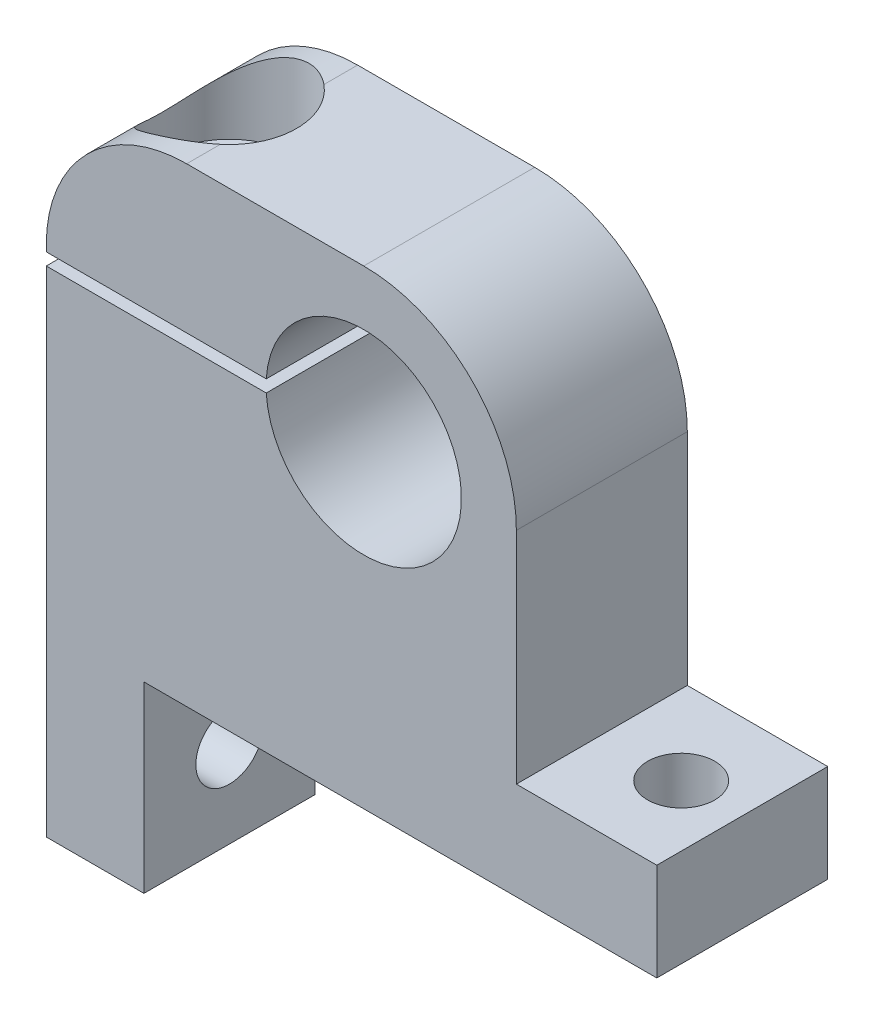
ISO-10303-21;
HEADER;
FILE_DESCRIPTION(('STEP AP214'),'2;1');
FILE_NAME('part.step','',(''),(''),'','','');
FILE_SCHEMA(('AUTOMOTIVE_DESIGN { 1 0 10303 214 1 1 1 1 }'));
ENDSEC;
DATA;
#1=APPLICATION_CONTEXT('core data for automotive mechanical design processes');
#2=APPLICATION_PROTOCOL_DEFINITION('international standard','automotive_design',2000,#1);
#3=PRODUCT_CONTEXT('',#1,'mechanical');
#4=PRODUCT('Part','Part','',(#3));
#5=PRODUCT_RELATED_PRODUCT_CATEGORY('part','',(#4));
#6=PRODUCT_DEFINITION_FORMATION('','',#4);
#7=PRODUCT_DEFINITION_CONTEXT('part definition',#1,'design');
#8=PRODUCT_DEFINITION('design','',#6,#7);
#9=PRODUCT_DEFINITION_SHAPE('','',#8);
#10=(LENGTH_UNIT() NAMED_UNIT(*) SI_UNIT(.MILLI.,.METRE.));
#11=(NAMED_UNIT(*) PLANE_ANGLE_UNIT() SI_UNIT($,.RADIAN.));
#12=(NAMED_UNIT(*) SI_UNIT($,.STERADIAN.) SOLID_ANGLE_UNIT());
#13=UNCERTAINTY_MEASURE_WITH_UNIT(LENGTH_MEASURE(1.E-05),#10,'distance_accuracy_value','');
#14=(GEOMETRIC_REPRESENTATION_CONTEXT(3) GLOBAL_UNCERTAINTY_ASSIGNED_CONTEXT((#13)) GLOBAL_UNIT_ASSIGNED_CONTEXT((#10,
#11,#12)) REPRESENTATION_CONTEXT('',''));
#15=CARTESIAN_POINT('',(0.,0.,0.));
#16=DIRECTION('',(0.,0.,1.));
#17=DIRECTION('',(1.,0.,0.));
#18=AXIS2_PLACEMENT_3D('',#15,#16,#17);
#19=CARTESIAN_POINT('',(-26.,0.499999999999997,14.));
#20=DIRECTION('',(0.,1.,0.));
#21=DIRECTION('',(0.,0.,1.));
#22=AXIS2_PLACEMENT_3D('',#19,#20,#21);
#23=PLANE('',#22);
#24=DIRECTION('',(1.,0.,0.));
#25=VECTOR('',#24,1.);
#26=CARTESIAN_POINT('',(-26.,0.499999999999997,0.));
#27=LINE('',#26,#25);
#28=CARTESIAN_POINT('',(-26.,0.499999999999997,0.));
#29=VERTEX_POINT('',#28);
#30=CARTESIAN_POINT('',(-7.98435971133565,0.499999999999998,0.));
#31=VERTEX_POINT('',#30);
#32=EDGE_CURVE('E191',#29,#31,#27,.T.);
#33=ORIENTED_EDGE('',*,*,#32,.T.);
#34=DIRECTION('',(0.,0.,-1.));
#35=VECTOR('',#34,1.);
#36=CARTESIAN_POINT('',(-7.98435971133565,0.499999999999998,14.));
#37=LINE('',#36,#35);
#38=CARTESIAN_POINT('',(-7.98435971133565,0.499999999999998,14.));
#39=VERTEX_POINT('',#38);
#40=EDGE_CURVE('E242',#39,#31,#37,.T.);
#41=ORIENTED_EDGE('',*,*,#40,.F.);
#42=DIRECTION('',(1.,0.,0.));
#43=VECTOR('',#42,1.);
#44=CARTESIAN_POINT('',(-26.,0.499999999999997,14.));
#45=LINE('',#44,#43);
#46=CARTESIAN_POINT('',(-26.,0.499999999999997,14.));
#47=VERTEX_POINT('',#46);
#48=EDGE_CURVE('E271',#47,#39,#45,.T.);
#49=ORIENTED_EDGE('',*,*,#48,.F.);
#50=DIRECTION('',(0.,0.,-1.));
#51=VECTOR('',#50,1.);
#52=CARTESIAN_POINT('',(-26.,0.499999999999997,14.));
#53=LINE('',#52,#51);
#54=EDGE_CURVE('E245',#47,#29,#53,.T.);
#55=ORIENTED_EDGE('',*,*,#54,.T.);
#56=EDGE_LOOP('',(#33,#41,#49,#55));
#57=FACE_BOUND('',#56,.T.);
#58=CARTESIAN_POINT('',(-18.,0.499999999999997,7.));
#59=DIRECTION('',(0.,1.,0.));
#60=DIRECTION('',(0.,0.,1.));
#61=AXIS2_PLACEMENT_3D('',#58,#59,#60);
#62=CIRCLE('',#61,3.3);
#63=CARTESIAN_POINT('',(-18.,0.499999999999997,10.3));
#64=VERTEX_POINT('',#63);
#65=EDGE_CURVE('E259',#64,#64,#62,.F.);
#66=ORIENTED_EDGE('',*,*,#65,.F.);
#67=EDGE_LOOP('',(#66));
#68=FACE_BOUND('',#67,.T.);
#69=ADVANCED_FACE('F38',(#57,#68),#23,.F.);
#70=CARTESIAN_POINT('',(-14.5,0.999999999999999,14.));
#71=DIRECTION('',(0.,0.,-1.));
#72=DIRECTION('',(-1.,0.,0.));
#73=AXIS2_PLACEMENT_3D('',#70,#71,#72);
#74=CYLINDRICAL_SURFACE('',#73,11.5);
#75=DIRECTION('',(0.,0.,-1.));
#76=VECTOR('',#75,1.);
#77=CARTESIAN_POINT('',(-14.5,12.5,14.));
#78=LINE('',#77,#76);
#79=CARTESIAN_POINT('',(-14.5,12.5,14.));
#80=VERTEX_POINT('',#79);
#81=CARTESIAN_POINT('',(-14.5,12.5,11.2426406871193));
#82=VERTEX_POINT('',#81);
#83=EDGE_CURVE('E216',#80,#82,#78,.T.);
#84=ORIENTED_EDGE('',*,*,#83,.T.);
#85=CARTESIAN_POINT('',(-14.5,12.5,11.2426406871193));
#86=CARTESIAN_POINT('',(-14.6111942466584,12.5000106687531,11.3343966450895));
#87=CARTESIAN_POINT('',(-14.7260298038202,12.4983878808196,11.4217587191783));
#88=CARTESIAN_POINT('',(-14.9621378836701,12.4913147106558,11.5871686776096));
#89=CARTESIAN_POINT('',(-15.083411451809,12.4858637050034,11.6652150424742));
#90=CARTESIAN_POINT('',(-15.3313790533495,12.470581311947,11.811357908409));
#91=CARTESIAN_POINT('',(-15.4580670874255,12.4607546646271,11.8794650707877));
#92=CARTESIAN_POINT('',(-15.7159959321144,12.4362637000279,12.0053886085369));
#93=CARTESIAN_POINT('',(-15.8472363270452,12.4215998234073,12.063205920547));
#94=CARTESIAN_POINT('',(-16.1134385157996,12.387047758436,12.1683067889332));
#95=CARTESIAN_POINT('',(-16.2484056943317,12.3671516140405,12.2155740991615));
#96=CARTESIAN_POINT('',(-16.520816595921,12.3218978003502,12.2992761324464));
#97=CARTESIAN_POINT('',(-16.6582612129436,12.2965381219042,12.3357068587105));
#98=CARTESIAN_POINT('',(-16.9343274967822,12.2402790660783,12.397623048531));
#99=CARTESIAN_POINT('',(-17.0729478971216,12.209385068319,12.4231190601802));
#100=CARTESIAN_POINT('',(-17.3504563774279,12.1420508157764,12.4633103785247));
#101=CARTESIAN_POINT('',(-17.4893445384066,12.105608481257,12.4780016230754));
#102=CARTESIAN_POINT('',(-17.7650961472038,12.0276690323539,12.4967030599054));
#103=CARTESIAN_POINT('',(-17.9019666656709,11.986219103638,12.5008058909148));
#104=CARTESIAN_POINT('',(-18.1740200623172,11.8982596851884,12.4989316530094));
#105=CARTESIAN_POINT('',(-18.3092023185868,11.8517483889019,12.4929509738773));
#106=CARTESIAN_POINT('',(-18.7110098358027,11.7050661875066,12.4604550126368));
#107=CARTESIAN_POINT('',(-18.9739835021156,11.5977221358029,12.419391221956));
#108=CARTESIAN_POINT('',(-19.5066774138159,11.3574130494193,12.297271628149));
#109=CARTESIAN_POINT('',(-19.775011806133,11.2230346480178,12.2130622404469));
#110=CARTESIAN_POINT('',(-20.2897723552809,10.9405600576022,12.0083627948227));
#111=CARTESIAN_POINT('',(-20.5361894936106,10.7924582724079,11.887857890681));
#112=CARTESIAN_POINT('',(-20.9070851160675,10.5512294614554,11.6716102560195));
#113=CARTESIAN_POINT('',(-21.0396726837202,10.4608410088857,11.5863964044509));
#114=CARTESIAN_POINT('',(-21.2962446452161,10.2782440543976,11.4056084668565));
#115=CARTESIAN_POINT('',(-21.4202305420481,10.1860358740793,11.3100361982955));
#116=CARTESIAN_POINT('',(-21.6594687855619,10.0008293561667,11.1088626302598));
#117=CARTESIAN_POINT('',(-21.7747104184476,9.90783019970305,11.0032493739045));
#118=CARTESIAN_POINT('',(-21.9960206054591,9.72241384350424,10.7823616717934));
#119=CARTESIAN_POINT('',(-22.1020901593416,9.6299965813633,10.6670882816964));
#120=CARTESIAN_POINT('',(-22.296666057787,9.45445319118981,10.4365058789902));
#121=CARTESIAN_POINT('',(-22.3858982532455,9.37117222564351,10.3219272601192));
#122=CARTESIAN_POINT('',(-22.5559453536002,9.20765832471976,10.0845876203001));
#123=CARTESIAN_POINT('',(-22.6367592627035,9.12742575064581,9.96182563415757));
#124=CARTESIAN_POINT('',(-22.7893198358542,8.9717644617498,9.70818608687089));
#125=CARTESIAN_POINT('',(-22.8610804111433,8.89632846727053,9.57732144911718));
#126=CARTESIAN_POINT('',(-22.9949054237001,8.75217758076893,9.30730168936062));
#127=CARTESIAN_POINT('',(-23.0569743436469,8.68345958700325,9.16815044154923));
#128=CARTESIAN_POINT('',(-23.1901401713897,8.53291005784131,8.83177853212142));
#129=CARTESIAN_POINT('',(-23.2569555546383,8.45474206254377,8.63109586504327));
#130=CARTESIAN_POINT('',(-23.3403120928927,8.35532242999511,8.32007562834009));
#131=CARTESIAN_POINT('',(-23.365282850508,8.32515932176273,8.21476061675152));
#132=CARTESIAN_POINT('',(-23.4092020561406,8.27167890822509,8.00119854658612));
#133=CARTESIAN_POINT('',(-23.4281536935727,8.24835797788374,7.89295307391494));
#134=CARTESIAN_POINT('',(-23.4598225487247,8.20917660317303,7.67292522729112));
#135=CARTESIAN_POINT('',(-23.4724672736263,8.1934029893123,7.56111677012649));
#136=CARTESIAN_POINT('',(-23.4908843633721,8.1703708176385,7.33605706129324));
#137=CARTESIAN_POINT('',(-23.4966569839597,8.16311194295212,7.22280586347432));
#138=CARTESIAN_POINT('',(-23.5011671818523,8.15744409702538,6.99597170498146));
#139=CARTESIAN_POINT('',(-23.4999071287105,8.15903214494777,6.88238886893856));
#140=CARTESIAN_POINT('',(-23.4904034840985,8.17096171680874,6.65601321970029));
#141=CARTESIAN_POINT('',(-23.48216022661,8.1813028221199,6.54322036898286));
#142=CARTESIAN_POINT('',(-23.4504456085743,8.22084556963466,6.23830638757222));
#143=CARTESIAN_POINT('',(-23.4202698924441,8.25828183092805,6.04787812101916));
#144=CARTESIAN_POINT('',(-23.341738091856,8.35373624713366,5.67633971847189));
#145=CARTESIAN_POINT('',(-23.2933667213406,8.41177170498498,5.49523756312758));
#146=CARTESIAN_POINT('',(-23.1490465585056,8.58037344500275,5.04547269968958));
#147=CARTESIAN_POINT('',(-23.0416282949593,8.70214834920132,4.78465016097338));
#148=CARTESIAN_POINT('',(-22.8564900975065,8.9011038482616,4.41472453476059));
#149=CARTESIAN_POINT('',(-22.7906339423929,8.97027846082518,4.29476891446799));
#150=CARTESIAN_POINT('',(-22.6513664796752,9.11265106477583,4.06177221425353));
#151=CARTESIAN_POINT('',(-22.5779553950549,9.18584893738663,3.94873093041187));
#152=CARTESIAN_POINT('',(-22.3978177244957,9.36032889612234,3.69221347393214));
#153=CARTESIAN_POINT('',(-22.2882538879584,9.46269311047524,3.55146734971186));
#154=CARTESIAN_POINT('',(-22.0570051695337,9.66982055443308,3.28217714246033));
#155=CARTESIAN_POINT('',(-21.9353165652097,9.77458451313647,3.15363683054892));
#156=CARTESIAN_POINT('',(-21.6802626601608,9.98449327577557,2.90892321289788));
#157=CARTESIAN_POINT('',(-21.5468930221118,10.0896382071607,2.79275453669453));
#158=CARTESIAN_POINT('',(-21.2689166372364,10.2984939290248,2.57331595875209));
#159=CARTESIAN_POINT('',(-21.1243112189211,10.4022048873529,2.47004453580386));
#160=CARTESIAN_POINT('',(-20.8235083398927,10.6071078160883,2.27666182212243));
#161=CARTESIAN_POINT('',(-20.6672572806066,10.7082848595923,2.18661787123063));
#162=CARTESIAN_POINT('',(-20.3443059632518,10.9060555177459,2.02133260624103));
#163=CARTESIAN_POINT('',(-20.1776046061903,11.0026486484509,1.94609285246345));
#164=CARTESIAN_POINT('',(-19.8348623242656,11.1895669862721,1.8118317106245));
#165=CARTESIAN_POINT('',(-19.6588394740451,11.2799035924644,1.75278021459725));
#166=CARTESIAN_POINT('',(-19.298315096596,11.4530429635321,1.65216259476241));
#167=CARTESIAN_POINT('',(-19.1138170570348,11.5358487863686,1.61058934864213));
#168=CARTESIAN_POINT('',(-18.7885467414274,11.6714825153969,1.55503760253596));
#169=CARTESIAN_POINT('',(-18.6493766478275,11.7263789064619,1.53664308785624));
#170=CARTESIAN_POINT('',(-18.36812150538,11.8309800080726,1.51051721129118));
#171=CARTESIAN_POINT('',(-18.2260370257515,11.8806857210913,1.50278378690199));
#172=CARTESIAN_POINT('',(-17.9399578410434,11.9744856938694,1.4984687517631));
#173=CARTESIAN_POINT('',(-17.7959644791893,12.0185836899149,1.50187967492925));
#174=CARTESIAN_POINT('',(-17.5070256713427,12.1009170992575,1.52022538706753));
#175=CARTESIAN_POINT('',(-17.3620802056409,12.139152390791,1.53516041534701));
#176=CARTESIAN_POINT('',(-17.0719002241773,12.2097146264226,1.5768837180193));
#177=CARTESIAN_POINT('',(-16.926666479767,12.2420203596797,1.60371341611818));
#178=CARTESIAN_POINT('',(-16.6376825878385,12.3005331245525,1.66932967449901));
#179=CARTESIAN_POINT('',(-16.4939323879913,12.3267403719881,1.70811581154083));
#180=CARTESIAN_POINT('',(-16.2091418893973,12.3731988547041,1.79758665230498));
#181=CARTESIAN_POINT('',(-16.0681024357094,12.3934482599345,1.84827500341095));
#182=CARTESIAN_POINT('',(-15.7900992342022,12.4282669079915,1.96126344744002));
#183=CARTESIAN_POINT('',(-15.6531345149881,12.4428375147997,2.02356074670818));
#184=CARTESIAN_POINT('',(-15.33758083704,12.4708969115861,2.1830853719271));
#185=CARTESIAN_POINT('',(-15.1610928162277,12.4822448381635,2.28492402091298));
#186=CARTESIAN_POINT('',(-14.9057536505255,12.4931562765306,2.45181479867278));
#187=CARTESIAN_POINT('',(-14.822268885313,12.495775353981,2.50974873277159));
#188=CARTESIAN_POINT('',(-14.6585979967358,12.4991972930952,2.63017771292599));
#189=CARTESIAN_POINT('',(-14.578412362573,12.4999998863532,2.69267343162828));
#190=CARTESIAN_POINT('',(-14.5,12.5,2.75735931288072));
#191=B_SPLINE_CURVE_WITH_KNOTS('',3,(#85,#86,#87,#88,#89,#90,#91,#92,#93,#94,#95,#96,#97,#98,
#99,#100,#101,#102,#103,#104,#105,#106,#107,#108,#109,#110,#111,#112,#113,#114,#115,#116,#117,
#118,#119,#120,#121,#122,#123,#124,#125,#126,#127,#128,#129,#130,#131,#132,#133,#134,#135,#136,
#137,#138,#139,#140,#141,#142,#143,#144,#145,#146,#147,#148,#149,#150,#151,#152,#153,#154,#155,
#156,#157,#158,#159,#160,#161,#162,#163,#164,#165,#166,#167,#168,#169,#170,#171,#172,#173,#174,
#175,#176,#177,#178,#179,#180,#181,#182,#183,#184,#185,#186,#187,#188,#189,#190),.UNSPECIFIED.,
.F.,.F.,(4,2,2,2,2,2,2,2,2,2,2,2,2,2,2,2,2,2,2,2,2,2,2,2,2,2,2,2,2,2,2,2,2,2,2,2,2,2,2,2,2,2,2,
2,2,2,2,2,2,2,2,2,4),(0.,0.432390268393834,0.864850967514368,1.29684432218585,1.72879833427318,
2.16141300036033,2.59418702784843,3.02654263887407,3.45906071471237,3.88778162975665,
4.31665607311199,5.17413418144371,6.10582391053408,7.03789525420915,7.58252326235584,
8.12705586551027,8.67224522351124,9.21737508075759,9.7191966574239,10.2210775269566,
10.7221775683556,11.2230451450774,11.8968368586621,12.2335835293136,12.5701514655912,
12.9105036198598,13.2508431076299,13.5910679300755,13.9312764817051,14.5178091208026,
15.1048356068226,16.0210061289116,16.4807650736597,16.9405104525071,17.5566715655435,
18.1730224331083,18.7896031381883,19.4061110497978,20.0256561881153,20.6452665897895,
21.263716658782,21.881914467152,22.3336619031103,22.7853219313438,23.2366794348994,
23.6880463115102,24.1409975939419,24.5939328444137,25.0470070765583,25.4999724183616,
26.1105629336174,26.4153726619811,26.7202274264582),.UNSPECIFIED.);
#192=CARTESIAN_POINT('',(-14.5,12.5,2.75735931288072));
#193=VERTEX_POINT('',#192);
#194=EDGE_CURVE('E11',#82,#193,#191,.T.);
#195=ORIENTED_EDGE('',*,*,#194,.T.);
#196=CARTESIAN_POINT('',(-14.5,12.5,0.));
#197=VERTEX_POINT('',#196);
#198=EDGE_CURVE('E116',#193,#197,#78,.T.);
#199=ORIENTED_EDGE('',*,*,#198,.T.);
#200=CARTESIAN_POINT('',(-14.5,0.999999999999999,0.));
#201=DIRECTION('',(0.,0.,1.));
#202=DIRECTION('',(1.,0.,0.));
#203=AXIS2_PLACEMENT_3D('',#200,#201,#202);
#204=CIRCLE('',#203,11.5);
#205=CARTESIAN_POINT('',(-26.,0.999999999999998,0.));
#206=VERTEX_POINT('',#205);
#207=EDGE_CURVE('E186',#197,#206,#204,.T.);
#208=ORIENTED_EDGE('',*,*,#207,.T.);
#209=DIRECTION('',(0.,0.,-1.));
#210=VECTOR('',#209,1.);
#211=CARTESIAN_POINT('',(-26.,0.999999999999998,14.));
#212=LINE('',#211,#210);
#213=CARTESIAN_POINT('',(-26.,0.999999999999998,14.));
#214=VERTEX_POINT('',#213);
#215=EDGE_CURVE('E51',#214,#206,#212,.T.);
#216=ORIENTED_EDGE('',*,*,#215,.F.);
#217=CARTESIAN_POINT('',(-14.5,0.999999999999999,14.));
#218=DIRECTION('',(0.,0.,1.));
#219=DIRECTION('',(1.,0.,0.));
#220=AXIS2_PLACEMENT_3D('',#217,#218,#219);
#221=CIRCLE('',#220,11.5);
#222=EDGE_CURVE('E215',#80,#214,#221,.T.);
#223=ORIENTED_EDGE('',*,*,#222,.F.);
#224=EDGE_LOOP('',(#84,#195,#199,#208,#216,#223));
#225=FACE_BOUND('',#224,.T.);
#226=ADVANCED_FACE('F40',(#225),#74,.T.);
#227=CARTESIAN_POINT('',(-26.,0.999999999999998,14.));
#228=DIRECTION('',(1.,0.,0.));
#229=DIRECTION('',(0.,0.,-1.));
#230=AXIS2_PLACEMENT_3D('',#227,#228,#229);
#231=PLANE('',#230);
#232=DIRECTION('',(0.,-1.,0.));
#233=VECTOR('',#232,1.);
#234=CARTESIAN_POINT('',(-26.,0.999999999999998,0.));
#235=LINE('',#234,#233);
#236=EDGE_CURVE('E188',#206,#29,#235,.T.);
#237=ORIENTED_EDGE('',*,*,#236,.T.);
#238=ORIENTED_EDGE('',*,*,#54,.F.);
#239=DIRECTION('',(0.,-1.,0.));
#240=VECTOR('',#239,1.);
#241=CARTESIAN_POINT('',(-26.,0.999999999999998,14.));
#242=LINE('',#241,#240);
#243=EDGE_CURVE('E125',#214,#47,#242,.T.);
#244=ORIENTED_EDGE('',*,*,#243,.F.);
#245=ORIENTED_EDGE('',*,*,#215,.T.);
#246=EDGE_LOOP('',(#237,#238,#244,#245));
#247=FACE_BOUND('',#246,.T.);
#248=ADVANCED_FACE('F306',(#247),#231,.F.);
#249=CARTESIAN_POINT('',(0.,0.,14.));
#250=DIRECTION('',(0.,0.,-1.));
#251=DIRECTION('',(-1.,0.,0.));
#252=AXIS2_PLACEMENT_3D('',#249,#250,#251);
#253=CYLINDRICAL_SURFACE('',#252,8.);
#254=CARTESIAN_POINT('',(0.,0.,0.));
#255=DIRECTION('',(0.,0.,-1.));
#256=DIRECTION('',(1.,0.,0.));
#257=AXIS2_PLACEMENT_3D('',#254,#255,#256);
#258=CIRCLE('',#257,8.);
#259=CARTESIAN_POINT('',(-7.98435971133566,-0.499999999999999,0.));
#260=VERTEX_POINT('',#259);
#261=EDGE_CURVE('E193',#31,#260,#258,.T.);
#262=ORIENTED_EDGE('',*,*,#261,.T.);
#263=DIRECTION('',(0.,0.,-1.));
#264=VECTOR('',#263,1.);
#265=CARTESIAN_POINT('',(-7.98435971133566,-0.499999999999999,14.));
#266=LINE('',#265,#264);
#267=CARTESIAN_POINT('',(-7.98435971133566,-0.499999999999999,14.));
#268=VERTEX_POINT('',#267);
#269=EDGE_CURVE('E239',#268,#260,#266,.T.);
#270=ORIENTED_EDGE('',*,*,#269,.F.);
#271=CARTESIAN_POINT('',(0.,0.,14.));
#272=DIRECTION('',(0.,0.,-1.));
#273=DIRECTION('',(1.,0.,0.));
#274=AXIS2_PLACEMENT_3D('',#271,#272,#273);
#275=CIRCLE('',#274,8.);
#276=EDGE_CURVE('E273',#39,#268,#275,.T.);
#277=ORIENTED_EDGE('',*,*,#276,.F.);
#278=ORIENTED_EDGE('',*,*,#40,.T.);
#279=EDGE_LOOP('',(#262,#270,#277,#278));
#280=FACE_BOUND('',#279,.T.);
#281=ADVANCED_FACE('F314',(#280),#253,.F.);
#282=CARTESIAN_POINT('',(-26.,-0.500000000000003,14.));
#283=DIRECTION('',(0.,-1.,0.));
#284=DIRECTION('',(1.,0.,0.));
#285=AXIS2_PLACEMENT_3D('',#282,#283,#284);
#286=PLANE('',#285);
#287=CARTESIAN_POINT('',(-18.,-0.500000000000001,7.));
#288=DIRECTION('',(0.,1.,0.));
#289=DIRECTION('',(0.,0.,1.));
#290=AXIS2_PLACEMENT_3D('',#287,#288,#289);
#291=CIRCLE('',#290,3.025);
#292=CARTESIAN_POINT('',(-18.,-0.500000000000001,10.025));
#293=VERTEX_POINT('',#292);
#294=EDGE_CURVE('E550',#293,#293,#291,.T.);
#295=ORIENTED_EDGE('',*,*,#294,.F.);
#296=EDGE_LOOP('',(#295));
#297=FACE_BOUND('',#296,.T.);
#298=DIRECTION('',(-1.,0.,0.));
#299=VECTOR('',#298,1.);
#300=CARTESIAN_POINT('',(-26.,-0.500000000000003,0.));
#301=LINE('',#300,#299);
#302=CARTESIAN_POINT('',(-26.,-0.500000000000003,0.));
#303=VERTEX_POINT('',#302);
#304=EDGE_CURVE('E195',#260,#303,#301,.T.);
#305=ORIENTED_EDGE('',*,*,#304,.T.);
#306=DIRECTION('',(0.,0.,-1.));
#307=VECTOR('',#306,1.);
#308=CARTESIAN_POINT('',(-26.,-0.500000000000003,14.));
#309=LINE('',#308,#307);
#310=CARTESIAN_POINT('',(-26.,-0.500000000000003,14.));
#311=VERTEX_POINT('',#310);
#312=EDGE_CURVE('E236',#311,#303,#309,.T.);
#313=ORIENTED_EDGE('',*,*,#312,.F.);
#314=DIRECTION('',(-1.,0.,0.));
#315=VECTOR('',#314,1.);
#316=CARTESIAN_POINT('',(-26.,-0.500000000000003,14.));
#317=LINE('',#316,#315);
#318=EDGE_CURVE('E275',#268,#311,#317,.T.);
#319=ORIENTED_EDGE('',*,*,#318,.F.);
#320=ORIENTED_EDGE('',*,*,#269,.T.);
#321=EDGE_LOOP('',(#305,#313,#319,#320));
#322=FACE_BOUND('',#321,.T.);
#323=ADVANCED_FACE('F320',(#297,#322),#286,.F.);
#324=CARTESIAN_POINT('',(-26.,-41.,14.));
#325=DIRECTION('',(1.,0.,0.));
#326=DIRECTION('',(0.,0.,-1.));
#327=AXIS2_PLACEMENT_3D('',#324,#325,#326);
#328=PLANE('',#327);
#329=CARTESIAN_POINT('',(-26.,-34.,7.));
#330=DIRECTION('',(-1.,0.,0.));
#331=DIRECTION('',(0.,0.,1.));
#332=AXIS2_PLACEMENT_3D('',#329,#330,#331);
#333=CIRCLE('',#332,2.75);
#334=CARTESIAN_POINT('',(-26.,-34.,9.75));
#335=VERTEX_POINT('',#334);
#336=EDGE_CURVE('E253',#335,#335,#333,.T.);
#337=ORIENTED_EDGE('',*,*,#336,.F.);
#338=EDGE_LOOP('',(#337));
#339=FACE_BOUND('',#338,.T.);
#340=DIRECTION('',(0.,-1.,0.));
#341=VECTOR('',#340,1.);
#342=CARTESIAN_POINT('',(-26.,-41.,0.));
#343=LINE('',#342,#341);
#344=CARTESIAN_POINT('',(-26.,-41.,0.));
#345=VERTEX_POINT('',#344);
#346=EDGE_CURVE('E198',#303,#345,#343,.T.);
#347=ORIENTED_EDGE('',*,*,#346,.T.);
#348=DIRECTION('',(0.,0.,-1.));
#349=VECTOR('',#348,1.);
#350=CARTESIAN_POINT('',(-26.,-41.,14.));
#351=LINE('',#350,#349);
#352=CARTESIAN_POINT('',(-26.,-41.,14.));
#353=VERTEX_POINT('',#352);
#354=EDGE_CURVE('E233',#353,#345,#351,.T.);
#355=ORIENTED_EDGE('',*,*,#354,.F.);
#356=DIRECTION('',(0.,-1.,0.));
#357=VECTOR('',#356,1.);
#358=CARTESIAN_POINT('',(-26.,-0.500000000000003,14.));
#359=LINE('',#358,#357);
#360=EDGE_CURVE('E277',#311,#353,#359,.T.);
#361=ORIENTED_EDGE('',*,*,#360,.F.);
#362=ORIENTED_EDGE('',*,*,#312,.T.);
#363=EDGE_LOOP('',(#347,#355,#361,#362));
#364=FACE_BOUND('',#363,.T.);
#365=ADVANCED_FACE('F323',(#339,#364),#328,.F.);
#366=CARTESIAN_POINT('',(-18.,-41.,14.));
#367=DIRECTION('',(0.,1.,0.));
#368=DIRECTION('',(0.,0.,1.));
#369=AXIS2_PLACEMENT_3D('',#366,#367,#368);
#370=PLANE('',#369);
#371=DIRECTION('',(1.,0.,0.));
#372=VECTOR('',#371,1.);
#373=CARTESIAN_POINT('',(-18.,-41.,0.));
#374=LINE('',#373,#372);
#375=CARTESIAN_POINT('',(-18.,-41.,0.));
#376=VERTEX_POINT('',#375);
#377=EDGE_CURVE('E200',#345,#376,#374,.T.);
#378=ORIENTED_EDGE('',*,*,#377,.T.);
#379=DIRECTION('',(0.,0.,-1.));
#380=VECTOR('',#379,1.);
#381=CARTESIAN_POINT('',(-18.,-41.,14.));
#382=LINE('',#381,#380);
#383=CARTESIAN_POINT('',(-18.,-41.,14.));
#384=VERTEX_POINT('',#383);
#385=EDGE_CURVE('E230',#384,#376,#382,.T.);
#386=ORIENTED_EDGE('',*,*,#385,.F.);
#387=DIRECTION('',(1.,0.,0.));
#388=VECTOR('',#387,1.);
#389=CARTESIAN_POINT('',(-18.,-41.,14.));
#390=LINE('',#389,#388);
#391=EDGE_CURVE('E279',#353,#384,#390,.T.);
#392=ORIENTED_EDGE('',*,*,#391,.F.);
#393=ORIENTED_EDGE('',*,*,#354,.T.);
#394=EDGE_LOOP('',(#378,#386,#392,#393));
#395=FACE_BOUND('',#394,.T.);
#396=ADVANCED_FACE('F328',(#395),#370,.F.);
#397=CARTESIAN_POINT('',(-18.,-26.,14.));
#398=DIRECTION('',(-1.,0.,0.));
#399=DIRECTION('',(0.,0.,1.));
#400=AXIS2_PLACEMENT_3D('',#397,#398,#399);
#401=PLANE('',#400);
#402=CARTESIAN_POINT('',(-18.,-34.,7.));
#403=DIRECTION('',(-1.,0.,0.));
#404=DIRECTION('',(0.,0.,1.));
#405=AXIS2_PLACEMENT_3D('',#402,#403,#404);
#406=CIRCLE('',#405,2.75);
#407=CARTESIAN_POINT('',(-18.,-34.,9.75));
#408=VERTEX_POINT('',#407);
#409=EDGE_CURVE('E251',#408,#408,#406,.T.);
#410=ORIENTED_EDGE('',*,*,#409,.T.);
#411=EDGE_LOOP('',(#410));
#412=FACE_BOUND('',#411,.T.);
#413=DIRECTION('',(0.,1.,0.));
#414=VECTOR('',#413,1.);
#415=CARTESIAN_POINT('',(-18.,-26.,0.));
#416=LINE('',#415,#414);
#417=CARTESIAN_POINT('',(-18.,-26.,0.));
#418=VERTEX_POINT('',#417);
#419=EDGE_CURVE('E202',#376,#418,#416,.T.);
#420=ORIENTED_EDGE('',*,*,#419,.T.);
#421=DIRECTION('',(0.,0.,-1.));
#422=VECTOR('',#421,1.);
#423=CARTESIAN_POINT('',(-18.,-26.,14.));
#424=LINE('',#423,#422);
#425=CARTESIAN_POINT('',(-18.,-26.,14.));
#426=VERTEX_POINT('',#425);
#427=EDGE_CURVE('E227',#426,#418,#424,.T.);
#428=ORIENTED_EDGE('',*,*,#427,.F.);
#429=DIRECTION('',(0.,1.,0.));
#430=VECTOR('',#429,1.);
#431=CARTESIAN_POINT('',(-18.,-26.,14.));
#432=LINE('',#431,#430);
#433=EDGE_CURVE('E281',#384,#426,#432,.T.);
#434=ORIENTED_EDGE('',*,*,#433,.F.);
#435=ORIENTED_EDGE('',*,*,#385,.T.);
#436=EDGE_LOOP('',(#420,#428,#434,#435));
#437=FACE_BOUND('',#436,.T.);
#438=ADVANCED_FACE('F332',(#412,#437),#401,.F.);
#439=CARTESIAN_POINT('',(24.,-26.,14.));
#440=DIRECTION('',(0.,1.,0.));
#441=DIRECTION('',(-1.,0.,0.));
#442=AXIS2_PLACEMENT_3D('',#439,#440,#441);
#443=PLANE('',#442);
#444=CARTESIAN_POINT('',(19.,-26.,7.));
#445=DIRECTION('',(0.,-1.,0.));
#446=DIRECTION('',(0.,0.,-1.));
#447=AXIS2_PLACEMENT_3D('',#444,#445,#446);
#448=CIRCLE('',#447,2.75);
#449=CARTESIAN_POINT('',(19.,-26.,4.25));
#450=VERTEX_POINT('',#449);
#451=EDGE_CURVE('E250',#450,#450,#448,.T.);
#452=ORIENTED_EDGE('',*,*,#451,.F.);
#453=EDGE_LOOP('',(#452));
#454=FACE_BOUND('',#453,.T.);
#455=DIRECTION('',(1.,0.,0.));
#456=VECTOR('',#455,1.);
#457=CARTESIAN_POINT('',(24.,-26.,0.));
#458=LINE('',#457,#456);
#459=CARTESIAN_POINT('',(24.,-26.,0.));
#460=VERTEX_POINT('',#459);
#461=EDGE_CURVE('E204',#418,#460,#458,.T.);
#462=ORIENTED_EDGE('',*,*,#461,.T.);
#463=DIRECTION('',(0.,0.,-1.));
#464=VECTOR('',#463,1.);
#465=CARTESIAN_POINT('',(24.,-26.,14.));
#466=LINE('',#465,#464);
#467=CARTESIAN_POINT('',(24.,-26.,14.));
#468=VERTEX_POINT('',#467);
#469=EDGE_CURVE('E224',#468,#460,#466,.T.);
#470=ORIENTED_EDGE('',*,*,#469,.F.);
#471=DIRECTION('',(1.,0.,0.));
#472=VECTOR('',#471,1.);
#473=CARTESIAN_POINT('',(24.,-26.,14.));
#474=LINE('',#473,#472);
#475=EDGE_CURVE('E283',#426,#468,#474,.T.);
#476=ORIENTED_EDGE('',*,*,#475,.F.);
#477=ORIENTED_EDGE('',*,*,#427,.T.);
#478=EDGE_LOOP('',(#462,#470,#476,#477));
#479=FACE_BOUND('',#478,.T.);
#480=ADVANCED_FACE('F336',(#454,#479),#443,.F.);
#481=CARTESIAN_POINT('',(24.,-18.,14.));
#482=DIRECTION('',(-1.,0.,0.));
#483=DIRECTION('',(0.,-1.,0.));
#484=AXIS2_PLACEMENT_3D('',#481,#482,#483);
#485=PLANE('',#484);
#486=DIRECTION('',(0.,1.,0.));
#487=VECTOR('',#486,1.);
#488=CARTESIAN_POINT('',(24.,-18.,0.));
#489=LINE('',#488,#487);
#490=CARTESIAN_POINT('',(24.,-18.,0.));
#491=VERTEX_POINT('',#490);
#492=EDGE_CURVE('E206',#460,#491,#489,.T.);
#493=ORIENTED_EDGE('',*,*,#492,.T.);
#494=DIRECTION('',(0.,0.,-1.));
#495=VECTOR('',#494,1.);
#496=CARTESIAN_POINT('',(24.,-18.,14.));
#497=LINE('',#496,#495);
#498=CARTESIAN_POINT('',(24.,-18.,14.));
#499=VERTEX_POINT('',#498);
#500=EDGE_CURVE('E221',#499,#491,#497,.T.);
#501=ORIENTED_EDGE('',*,*,#500,.F.);
#502=DIRECTION('',(0.,1.,0.));
#503=VECTOR('',#502,1.);
#504=CARTESIAN_POINT('',(24.,-18.,14.));
#505=LINE('',#504,#503);
#506=EDGE_CURVE('E285',#468,#499,#505,.T.);
#507=ORIENTED_EDGE('',*,*,#506,.F.);
#508=ORIENTED_EDGE('',*,*,#469,.T.);
#509=EDGE_LOOP('',(#493,#501,#507,#508));
#510=FACE_BOUND('',#509,.T.);
#511=ADVANCED_FACE('F291',(#510),#485,.F.);
#512=CARTESIAN_POINT('',(12.5,-18.,14.));
#513=DIRECTION('',(0.,-1.,0.));
#514=DIRECTION('',(1.,0.,0.));
#515=AXIS2_PLACEMENT_3D('',#512,#513,#514);
#516=PLANE('',#515);
#517=CARTESIAN_POINT('',(19.,-18.,7.));
#518=DIRECTION('',(0.,-1.,0.));
#519=DIRECTION('',(1.,0.,0.));
#520=AXIS2_PLACEMENT_3D('',#517,#518,#519);
#521=CIRCLE('',#520,2.75);
#522=CARTESIAN_POINT('',(21.75,-18.,7.));
#523=VERTEX_POINT('',#522);
#524=EDGE_CURVE('E189',#523,#523,#521,.T.);
#525=ORIENTED_EDGE('',*,*,#524,.T.);
#526=EDGE_LOOP('',(#525));
#527=FACE_BOUND('',#526,.T.);
#528=DIRECTION('',(-1.,0.,0.));
#529=VECTOR('',#528,1.);
#530=CARTESIAN_POINT('',(12.5,-18.,0.));
#531=LINE('',#530,#529);
#532=CARTESIAN_POINT('',(12.5,-18.,0.));
#533=VERTEX_POINT('',#532);
#534=EDGE_CURVE('E208',#491,#533,#531,.T.);
#535=ORIENTED_EDGE('',*,*,#534,.T.);
#536=DIRECTION('',(0.,0.,-1.));
#537=VECTOR('',#536,1.);
#538=CARTESIAN_POINT('',(12.5,-18.,14.));
#539=LINE('',#538,#537);
#540=CARTESIAN_POINT('',(12.5,-18.,14.));
#541=VERTEX_POINT('',#540);
#542=EDGE_CURVE('E177',#541,#533,#539,.T.);
#543=ORIENTED_EDGE('',*,*,#542,.F.);
#544=DIRECTION('',(-1.,0.,0.));
#545=VECTOR('',#544,1.);
#546=CARTESIAN_POINT('',(12.5,-18.,14.));
#547=LINE('',#546,#545);
#548=EDGE_CURVE('E165',#499,#541,#547,.T.);
#549=ORIENTED_EDGE('',*,*,#548,.F.);
#550=ORIENTED_EDGE('',*,*,#500,.T.);
#551=EDGE_LOOP('',(#535,#543,#549,#550));
#552=FACE_BOUND('',#551,.T.);
#553=ADVANCED_FACE('F295',(#527,#552),#516,.F.);
#554=CARTESIAN_POINT('',(12.5,0.,14.));
#555=DIRECTION('',(-1.,0.,0.));
#556=DIRECTION('',(0.,-1.,0.));
#557=AXIS2_PLACEMENT_3D('',#554,#555,#556);
#558=PLANE('',#557);
#559=DIRECTION('',(0.,1.,0.));
#560=VECTOR('',#559,1.);
#561=CARTESIAN_POINT('',(12.5,0.,0.));
#562=LINE('',#561,#560);
#563=CARTESIAN_POINT('',(12.5,0.,0.));
#564=VERTEX_POINT('',#563);
#565=EDGE_CURVE('E174',#533,#564,#562,.T.);
#566=ORIENTED_EDGE('',*,*,#565,.T.);
#567=DIRECTION('',(0.,0.,-1.));
#568=VECTOR('',#567,1.);
#569=CARTESIAN_POINT('',(12.5,0.,14.));
#570=LINE('',#569,#568);
#571=CARTESIAN_POINT('',(12.5,0.,14.));
#572=VERTEX_POINT('',#571);
#573=EDGE_CURVE('E171',#572,#564,#570,.T.);
#574=ORIENTED_EDGE('',*,*,#573,.F.);
#575=DIRECTION('',(0.,1.,0.));
#576=VECTOR('',#575,1.);
#577=CARTESIAN_POINT('',(12.5,0.,14.));
#578=LINE('',#577,#576);
#579=EDGE_CURVE('E158',#541,#572,#578,.T.);
#580=ORIENTED_EDGE('',*,*,#579,.F.);
#581=ORIENTED_EDGE('',*,*,#542,.T.);
#582=EDGE_LOOP('',(#566,#574,#580,#581));
#583=FACE_BOUND('',#582,.T.);
#584=ADVANCED_FACE('F172',(#583),#558,.F.);
#585=CARTESIAN_POINT('',(0.,0.,14.));
#586=DIRECTION('',(0.,0.,-1.));
#587=DIRECTION('',(-1.,0.,0.));
#588=AXIS2_PLACEMENT_3D('',#585,#586,#587);
#589=CYLINDRICAL_SURFACE('',#588,12.5);
#590=CARTESIAN_POINT('',(0.,0.,0.));
#591=DIRECTION('',(0.,0.,1.));
#592=DIRECTION('',(1.,0.,0.));
#593=AXIS2_PLACEMENT_3D('',#590,#591,#592);
#594=CIRCLE('',#593,12.5);
#595=CARTESIAN_POINT('',(0.,12.5,0.));
#596=VERTEX_POINT('',#595);
#597=EDGE_CURVE('E211',#564,#596,#594,.T.);
#598=ORIENTED_EDGE('',*,*,#597,.T.);
#599=DIRECTION('',(0.,0.,-1.));
#600=VECTOR('',#599,1.);
#601=CARTESIAN_POINT('',(0.,12.5,14.));
#602=LINE('',#601,#600);
#603=CARTESIAN_POINT('',(0.,12.5,14.));
#604=VERTEX_POINT('',#603);
#605=EDGE_CURVE('E178',#604,#596,#602,.T.);
#606=ORIENTED_EDGE('',*,*,#605,.F.);
#607=CARTESIAN_POINT('',(0.,0.,14.));
#608=DIRECTION('',(0.,0.,1.));
#609=DIRECTION('',(1.,0.,0.));
#610=AXIS2_PLACEMENT_3D('',#607,#608,#609);
#611=CIRCLE('',#610,12.5);
#612=EDGE_CURVE('E162',#572,#604,#611,.T.);
#613=ORIENTED_EDGE('',*,*,#612,.F.);
#614=ORIENTED_EDGE('',*,*,#573,.T.);
#615=EDGE_LOOP('',(#598,#606,#613,#614));
#616=FACE_BOUND('',#615,.T.);
#617=ADVANCED_FACE('F180',(#616),#589,.T.);
#618=CARTESIAN_POINT('',(0.,12.5,14.));
#619=DIRECTION('',(0.,-1.,0.));
#620=DIRECTION('',(1.,0.,0.));
#621=AXIS2_PLACEMENT_3D('',#618,#619,#620);
#622=PLANE('',#621);
#623=ORIENTED_EDGE('',*,*,#198,.F.);
#624=CARTESIAN_POINT('',(-18.,12.5,7.));
#625=DIRECTION('',(0.,1.,0.));
#626=DIRECTION('',(0.,0.,1.));
#627=AXIS2_PLACEMENT_3D('',#624,#625,#626);
#628=CIRCLE('',#627,5.5);
#629=EDGE_CURVE('E57',#82,#193,#628,.T.);
#630=ORIENTED_EDGE('',*,*,#629,.F.);
#631=ORIENTED_EDGE('',*,*,#83,.F.);
#632=DIRECTION('',(-1.,0.,0.));
#633=VECTOR('',#632,1.);
#634=CARTESIAN_POINT('',(0.,12.5,14.));
#635=LINE('',#634,#633);
#636=EDGE_CURVE('E65',#604,#80,#635,.T.);
#637=ORIENTED_EDGE('',*,*,#636,.F.);
#638=ORIENTED_EDGE('',*,*,#605,.T.);
#639=DIRECTION('',(-1.,0.,0.));
#640=VECTOR('',#639,1.);
#641=CARTESIAN_POINT('',(0.,12.5,0.));
#642=LINE('',#641,#640);
#643=EDGE_CURVE('E213',#596,#197,#642,.T.);
#644=ORIENTED_EDGE('',*,*,#643,.T.);
#645=EDGE_LOOP('',(#623,#630,#631,#637,#638,#644));
#646=FACE_BOUND('',#645,.T.);
#647=ADVANCED_FACE('F301',(#646),#622,.F.);
#648=CARTESIAN_POINT('',(-14.5,0.999999999999999,14.));
#649=DIRECTION('',(0.,0.,1.));
#650=DIRECTION('',(1.,0.,0.));
#651=AXIS2_PLACEMENT_3D('',#648,#649,#650);
#652=PLANE('',#651);
#653=ORIENTED_EDGE('',*,*,#222,.T.);
#654=ORIENTED_EDGE('',*,*,#243,.T.);
#655=ORIENTED_EDGE('',*,*,#48,.T.);
#656=ORIENTED_EDGE('',*,*,#276,.T.);
#657=ORIENTED_EDGE('',*,*,#318,.T.);
#658=ORIENTED_EDGE('',*,*,#360,.T.);
#659=ORIENTED_EDGE('',*,*,#391,.T.);
#660=ORIENTED_EDGE('',*,*,#433,.T.);
#661=ORIENTED_EDGE('',*,*,#475,.T.);
#662=ORIENTED_EDGE('',*,*,#506,.T.);
#663=ORIENTED_EDGE('',*,*,#548,.T.);
#664=ORIENTED_EDGE('',*,*,#579,.T.);
#665=ORIENTED_EDGE('',*,*,#612,.T.);
#666=ORIENTED_EDGE('',*,*,#636,.T.);
#667=EDGE_LOOP('',(#653,#654,#655,#656,#657,#658,#659,#660,#661,#662,#663,#664,#665,#666));
#668=FACE_BOUND('',#667,.T.);
#669=ADVANCED_FACE('F160',(#668),#652,.T.);
#670=CARTESIAN_POINT('',(-14.5,0.999999999999999,0.));
#671=DIRECTION('',(0.,0.,1.));
#672=DIRECTION('',(1.,0.,0.));
#673=AXIS2_PLACEMENT_3D('',#670,#671,#672);
#674=PLANE('',#673);
#675=ORIENTED_EDGE('',*,*,#207,.F.);
#676=ORIENTED_EDGE('',*,*,#643,.F.);
#677=ORIENTED_EDGE('',*,*,#597,.F.);
#678=ORIENTED_EDGE('',*,*,#565,.F.);
#679=ORIENTED_EDGE('',*,*,#534,.F.);
#680=ORIENTED_EDGE('',*,*,#492,.F.);
#681=ORIENTED_EDGE('',*,*,#461,.F.);
#682=ORIENTED_EDGE('',*,*,#419,.F.);
#683=ORIENTED_EDGE('',*,*,#377,.F.);
#684=ORIENTED_EDGE('',*,*,#346,.F.);
#685=ORIENTED_EDGE('',*,*,#304,.F.);
#686=ORIENTED_EDGE('',*,*,#261,.F.);
#687=ORIENTED_EDGE('',*,*,#32,.F.);
#688=ORIENTED_EDGE('',*,*,#236,.F.);
#689=EDGE_LOOP('',(#675,#676,#677,#678,#679,#680,#681,#682,#683,#684,#685,#686,#687,#688));
#690=FACE_BOUND('',#689,.T.);
#691=ADVANCED_FACE('F298',(#690),#674,.F.);
#692=CARTESIAN_POINT('',(19.,12.5,7.));
#693=DIRECTION('',(0.,-1.,0.));
#694=DIRECTION('',(0.,0.,-1.));
#695=AXIS2_PLACEMENT_3D('',#692,#693,#694);
#696=CYLINDRICAL_SURFACE('',#695,2.75);
#697=ORIENTED_EDGE('',*,*,#451,.T.);
#698=EDGE_LOOP('',(#697));
#699=FACE_BOUND('',#698,.T.);
#700=ORIENTED_EDGE('',*,*,#524,.F.);
#701=EDGE_LOOP('',(#700));
#702=FACE_BOUND('',#701,.T.);
#703=ADVANCED_FACE('F393',(#699,#702),#696,.F.);
#704=CARTESIAN_POINT('',(24.,-34.,7.));
#705=DIRECTION('',(-1.,0.,0.));
#706=DIRECTION('',(0.,0.,1.));
#707=AXIS2_PLACEMENT_3D('',#704,#705,#706);
#708=CYLINDRICAL_SURFACE('',#707,2.75);
#709=CARTESIAN_POINT('',(-26.,-34.,9.75));
#710=CARTESIAN_POINT('',(-25.9166666666667,-34.,9.75));
#711=CARTESIAN_POINT('',(-25.8333333333333,-34.,9.75));
#712=CARTESIAN_POINT('',(-25.6666666666667,-34.,9.75));
#713=CARTESIAN_POINT('',(-25.5833333333333,-34.,9.75));
#714=CARTESIAN_POINT('',(-25.4166666666667,-34.,9.75));
#715=CARTESIAN_POINT('',(-25.3333333333333,-34.,9.75));
#716=CARTESIAN_POINT('',(-25.1666666666667,-34.,9.75));
#717=CARTESIAN_POINT('',(-25.0833333333333,-34.,9.75));
#718=CARTESIAN_POINT('',(-24.9166666666667,-34.,9.75));
#719=CARTESIAN_POINT('',(-24.8333333333333,-34.,9.75));
#720=CARTESIAN_POINT('',(-24.6666666666667,-34.,9.75));
#721=CARTESIAN_POINT('',(-24.5833333333333,-34.,9.75));
#722=CARTESIAN_POINT('',(-24.4166666666667,-34.,9.75));
#723=CARTESIAN_POINT('',(-24.3333333333333,-34.,9.75));
#724=CARTESIAN_POINT('',(-24.1666666666667,-34.,9.75));
#725=CARTESIAN_POINT('',(-24.0833333333333,-34.,9.75));
#726=CARTESIAN_POINT('',(-23.9166666666667,-34.,9.75));
#727=CARTESIAN_POINT('',(-23.8333333333333,-34.,9.75));
#728=CARTESIAN_POINT('',(-23.6666666666667,-34.,9.75));
#729=CARTESIAN_POINT('',(-23.5833333333333,-34.,9.75));
#730=CARTESIAN_POINT('',(-23.4166666666667,-34.,9.75));
#731=CARTESIAN_POINT('',(-23.3333333333333,-34.,9.75));
#732=CARTESIAN_POINT('',(-23.1666666666667,-34.,9.75));
#733=CARTESIAN_POINT('',(-23.0833333333333,-34.,9.75));
#734=CARTESIAN_POINT('',(-22.9166666666667,-34.,9.75));
#735=CARTESIAN_POINT('',(-22.8333333333333,-34.,9.75));
#736=CARTESIAN_POINT('',(-22.6666666666667,-34.,9.75));
#737=CARTESIAN_POINT('',(-22.5833333333333,-34.,9.75));
#738=CARTESIAN_POINT('',(-22.4166666666667,-34.,9.75));
#739=CARTESIAN_POINT('',(-22.3333333333333,-34.,9.75));
#740=CARTESIAN_POINT('',(-22.1666666666667,-34.,9.75));
#741=CARTESIAN_POINT('',(-22.0833333333333,-34.,9.75));
#742=CARTESIAN_POINT('',(-21.9166666666667,-34.,9.75));
#743=CARTESIAN_POINT('',(-21.8333333333333,-34.,9.75));
#744=CARTESIAN_POINT('',(-21.6666666666667,-34.,9.75));
#745=CARTESIAN_POINT('',(-21.5833333333333,-34.,9.75));
#746=CARTESIAN_POINT('',(-21.4166666666667,-34.,9.75));
#747=CARTESIAN_POINT('',(-21.3333333333333,-34.,9.75));
#748=CARTESIAN_POINT('',(-21.1666666666667,-34.,9.75));
#749=CARTESIAN_POINT('',(-21.0833333333333,-34.,9.75));
#750=CARTESIAN_POINT('',(-20.9166666666667,-34.,9.75));
#751=CARTESIAN_POINT('',(-20.8333333333333,-34.,9.75));
#752=CARTESIAN_POINT('',(-20.6666666666667,-34.,9.75));
#753=CARTESIAN_POINT('',(-20.5833333333333,-34.,9.75));
#754=CARTESIAN_POINT('',(-20.4166666666667,-34.,9.75));
#755=CARTESIAN_POINT('',(-20.3333333333333,-34.,9.75));
#756=CARTESIAN_POINT('',(-20.1666666666667,-34.,9.75));
#757=CARTESIAN_POINT('',(-20.0833333333333,-34.,9.75));
#758=CARTESIAN_POINT('',(-19.9166666666667,-34.,9.75));
#759=CARTESIAN_POINT('',(-19.8333333333333,-34.,9.75));
#760=CARTESIAN_POINT('',(-19.6666666666667,-34.,9.75));
#761=CARTESIAN_POINT('',(-19.5833333333333,-34.,9.75));
#762=CARTESIAN_POINT('',(-19.4166666666667,-34.,9.75));
#763=CARTESIAN_POINT('',(-19.3333333333333,-34.,9.75));
#764=CARTESIAN_POINT('',(-19.1666666666667,-34.,9.75));
#765=CARTESIAN_POINT('',(-19.0833333333333,-34.,9.75));
#766=CARTESIAN_POINT('',(-18.9166666666667,-34.,9.75));
#767=CARTESIAN_POINT('',(-18.8333333333333,-34.,9.75));
#768=CARTESIAN_POINT('',(-18.6666666666667,-34.,9.75));
#769=CARTESIAN_POINT('',(-18.5833333333333,-34.,9.75));
#770=CARTESIAN_POINT('',(-18.4166666666667,-34.,9.75));
#771=CARTESIAN_POINT('',(-18.3333333333333,-34.,9.75));
#772=CARTESIAN_POINT('',(-18.1666666666667,-34.,9.75));
#773=CARTESIAN_POINT('',(-18.0833333333333,-34.,9.75));
#774=CARTESIAN_POINT('',(-18.,-34.,9.75));
#775=B_SPLINE_CURVE_WITH_KNOTS('',3,(#709,#710,#711,#712,#713,#714,#715,#716,#717,#718,#719,
#720,#721,#722,#723,#724,#725,#726,#727,#728,#729,#730,#731,#732,#733,#734,#735,#736,#737,#738,
#739,#740,#741,#742,#743,#744,#745,#746,#747,#748,#749,#750,#751,#752,#753,#754,#755,#756,#757,
#758,#759,#760,#761,#762,#763,#764,#765,#766,#767,#768,#769,#770,#771,#772,#773,#774),
.UNSPECIFIED.,.F.,.F.,(4,2,2,2,2,2,2,2,2,2,2,2,2,2,2,2,2,2,2,2,2,2,2,2,2,2,2,2,2,2,2,2,4),(0.,
0.25,0.5,0.750000000000001,1.,1.25,1.5,1.75,2.,2.25,2.5,2.75,3.,3.25,3.5,3.75,4.,4.25,4.5,4.75,
5.,5.25,5.50000000000001,5.75000000000001,6.00000000000001,6.25000000000001,6.50000000000001,
6.75000000000001,7.00000000000001,7.25000000000001,7.50000000000001,7.75000000000001,
8.00000000000001),.UNSPECIFIED.);
#776=EDGE_CURVE('BSEAM388',#335,#408,#775,.T.);
#777=ORIENTED_EDGE('',*,*,#336,.T.);
#778=ORIENTED_EDGE('',*,*,#409,.F.);
#779=ORIENTED_EDGE('',*,*,#776,.T.);
#780=ORIENTED_EDGE('',*,*,#776,.F.);
#781=EDGE_LOOP('',(#777,#779,#778,#780));
#782=FACE_BOUND('',#781,.T.);
#783=ADVANCED_FACE('F388',(#782),#708,.F.);
#784=CARTESIAN_POINT('',(-18.,12.5,7.));
#785=DIRECTION('',(0.,1.,0.));
#786=DIRECTION('',(0.,0.,1.));
#787=AXIS2_PLACEMENT_3D('',#784,#785,#786);
#788=CYLINDRICAL_SURFACE('',#787,5.5);
#789=CARTESIAN_POINT('',(-18.,5.1,7.));
#790=DIRECTION('',(0.,1.,0.));
#791=DIRECTION('',(0.,0.,1.));
#792=AXIS2_PLACEMENT_3D('',#789,#790,#791);
#793=CIRCLE('',#792,5.5);
#794=CARTESIAN_POINT('',(-18.,5.1,12.5));
#795=VERTEX_POINT('',#794);
#796=EDGE_CURVE('E557',#795,#795,#793,.T.);
#797=ORIENTED_EDGE('',*,*,#796,.F.);
#798=EDGE_LOOP('',(#797));
#799=FACE_BOUND('',#798,.T.);
#800=ORIENTED_EDGE('',*,*,#629,.T.);
#801=ORIENTED_EDGE('',*,*,#194,.F.);
#802=EDGE_LOOP('',(#800,#801));
#803=FACE_BOUND('',#802,.T.);
#804=ADVANCED_FACE('F392',(#799,#803),#788,.F.);
#805=CARTESIAN_POINT('',(-18.,12.5,7.));
#806=DIRECTION('',(0.,1.,0.));
#807=DIRECTION('',(0.,0.,1.));
#808=AXIS2_PLACEMENT_3D('',#805,#806,#807);
#809=CYLINDRICAL_SURFACE('',#808,3.3);
#810=ORIENTED_EDGE('',*,*,#65,.T.);
#811=EDGE_LOOP('',(#810));
#812=FACE_BOUND('',#811,.T.);
#813=CARTESIAN_POINT('',(-18.,5.1,7.));
#814=DIRECTION('',(0.,1.,0.));
#815=DIRECTION('',(0.,0.,1.));
#816=AXIS2_PLACEMENT_3D('',#813,#814,#815);
#817=CIRCLE('',#816,3.3);
#818=CARTESIAN_POINT('',(-18.,5.1,10.3));
#819=VERTEX_POINT('',#818);
#820=EDGE_CURVE('E264',#819,#819,#817,.T.);
#821=ORIENTED_EDGE('',*,*,#820,.T.);
#822=EDGE_LOOP('',(#821));
#823=FACE_BOUND('',#822,.T.);
#824=ADVANCED_FACE('F428',(#812,#823),#809,.F.);
#825=CARTESIAN_POINT('',(-14.7,5.1,7.));
#826=DIRECTION('',(0.,-1.,0.));
#827=DIRECTION('',(0.,0.,-1.));
#828=AXIS2_PLACEMENT_3D('',#825,#826,#827);
#829=PLANE('',#828);
#830=ORIENTED_EDGE('',*,*,#820,.F.);
#831=EDGE_LOOP('',(#830));
#832=FACE_BOUND('',#831,.T.);
#833=ORIENTED_EDGE('',*,*,#796,.T.);
#834=EDGE_LOOP('',(#833));
#835=FACE_BOUND('',#834,.T.);
#836=ADVANCED_FACE('F437',(#832,#835),#829,.F.);
#837=CARTESIAN_POINT('',(-18.,-17.5,7.));
#838=DIRECTION('',(0.,1.,0.));
#839=DIRECTION('',(0.,0.,1.));
#840=AXIS2_PLACEMENT_3D('',#837,#838,#839);
#841=CONICAL_SURFACE('',#840,2.5,1.02974425867665);
#842=CARTESIAN_POINT('',(-18.,-19.0021515475689,7.));
#843=VERTEX_POINT('',#842);
#844=VERTEX_LOOP('',#843);
#845=FACE_BOUND('',#844,.T.);
#846=CARTESIAN_POINT('',(-18.,-17.5,7.));
#847=DIRECTION('',(0.,1.,0.));
#848=DIRECTION('',(0.,0.,1.));
#849=AXIS2_PLACEMENT_3D('',#846,#847,#848);
#850=CIRCLE('',#849,2.5);
#851=CARTESIAN_POINT('',(-18.,-17.5,9.5));
#852=VERTEX_POINT('',#851);
#853=EDGE_CURVE('E552',#852,#852,#850,.T.);
#854=ORIENTED_EDGE('',*,*,#853,.T.);
#855=EDGE_LOOP('',(#854));
#856=FACE_BOUND('',#855,.T.);
#857=ADVANCED_FACE('F446',(#845,#856),#841,.F.);
#858=CARTESIAN_POINT('',(-18.,-0.500000000000001,7.));
#859=DIRECTION('',(0.,1.,0.));
#860=DIRECTION('',(0.,0.,1.));
#861=AXIS2_PLACEMENT_3D('',#858,#859,#860);
#862=CYLINDRICAL_SURFACE('',#861,2.5);
#863=ORIENTED_EDGE('',*,*,#853,.F.);
#864=EDGE_LOOP('',(#863));
#865=FACE_BOUND('',#864,.T.);
#866=CARTESIAN_POINT('',(-18.,-0.803108891324555,7.));
#867=DIRECTION('',(0.,1.,0.));
#868=DIRECTION('',(0.,0.,1.));
#869=AXIS2_PLACEMENT_3D('',#866,#867,#868);
#870=CIRCLE('',#869,2.5);
#871=CARTESIAN_POINT('',(-18.,-0.803108891324555,9.5));
#872=VERTEX_POINT('',#871);
#873=EDGE_CURVE('E548',#872,#872,#870,.T.);
#874=ORIENTED_EDGE('',*,*,#873,.T.);
#875=EDGE_LOOP('',(#874));
#876=FACE_BOUND('',#875,.T.);
#877=ADVANCED_FACE('F463',(#865,#876),#862,.F.);
#878=CARTESIAN_POINT('',(-18.,-0.500000000000001,7.));
#879=DIRECTION('',(0.,1.,0.));
#880=DIRECTION('',(0.,0.,1.));
#881=AXIS2_PLACEMENT_3D('',#878,#879,#880);
#882=CONICAL_SURFACE('',#881,3.025,1.0471975511966);
#883=ORIENTED_EDGE('',*,*,#873,.F.);
#884=EDGE_LOOP('',(#883));
#885=FACE_BOUND('',#884,.T.);
#886=ORIENTED_EDGE('',*,*,#294,.T.);
#887=EDGE_LOOP('',(#886));
#888=FACE_BOUND('',#887,.T.);
#889=ADVANCED_FACE('F474',(#885,#888),#882,.F.);
#890=CLOSED_SHELL('',(#69,#226,#248,#281,#323,#365,#396,#438,#480,#511,#553,#584,#617,#647,#669,
#691,#703,#783,#804,#824,#836,#857,#877,#889));
#891=MANIFOLD_SOLID_BREP('B2',#890);
#892=ADVANCED_BREP_SHAPE_REPRESENTATION('',(#18,#891),#14);
#893=SHAPE_DEFINITION_REPRESENTATION(#9,#892);
ENDSEC;
END-ISO-10303-21;
